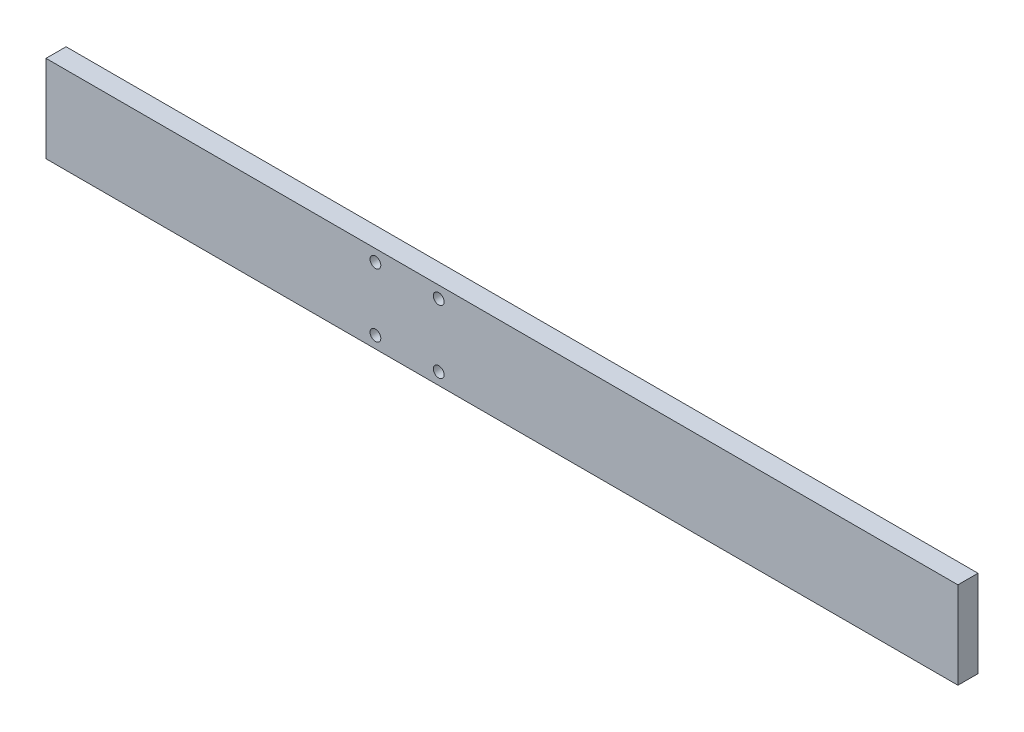
ISO-10303-21;
HEADER;
FILE_DESCRIPTION(('STEP AP214'),'2;1');
FILE_NAME('part.step','',(''),(''),'','','');
FILE_SCHEMA(('AUTOMOTIVE_DESIGN { 1 0 10303 214 1 1 1 1 }'));
ENDSEC;
DATA;
#1=APPLICATION_CONTEXT('core data for automotive mechanical design processes');
#2=APPLICATION_PROTOCOL_DEFINITION('international standard','automotive_design',2000,#1);
#3=PRODUCT_CONTEXT('',#1,'mechanical');
#4=PRODUCT('Part','Part','',(#3));
#5=PRODUCT_RELATED_PRODUCT_CATEGORY('part','',(#4));
#6=PRODUCT_DEFINITION_FORMATION('','',#4);
#7=PRODUCT_DEFINITION_CONTEXT('part definition',#1,'design');
#8=PRODUCT_DEFINITION('design','',#6,#7);
#9=PRODUCT_DEFINITION_SHAPE('','',#8);
#10=(LENGTH_UNIT() NAMED_UNIT(*) SI_UNIT(.MILLI.,.METRE.));
#11=(NAMED_UNIT(*) PLANE_ANGLE_UNIT() SI_UNIT($,.RADIAN.));
#12=(NAMED_UNIT(*) SI_UNIT($,.STERADIAN.) SOLID_ANGLE_UNIT());
#13=UNCERTAINTY_MEASURE_WITH_UNIT(LENGTH_MEASURE(1.E-05),#10,'distance_accuracy_value','');
#14=(GEOMETRIC_REPRESENTATION_CONTEXT(3) GLOBAL_UNCERTAINTY_ASSIGNED_CONTEXT((#13)) GLOBAL_UNIT_ASSIGNED_CONTEXT((#10,
#11,#12)) REPRESENTATION_CONTEXT('',''));
#15=CARTESIAN_POINT('',(0.,0.,0.));
#16=DIRECTION('',(0.,0.,1.));
#17=DIRECTION('',(1.,0.,0.));
#18=AXIS2_PLACEMENT_3D('',#15,#16,#17);
#19=CARTESIAN_POINT('',(0.,0.,6.35));
#20=DIRECTION('',(0.,0.,1.));
#21=DIRECTION('',(1.,0.,0.));
#22=AXIS2_PLACEMENT_3D('',#19,#20,#21);
#23=PLANE('',#22);
#24=CARTESIAN_POINT('',(124.145,23.75,6.35));
#25=DIRECTION('',(0.,0.,1.));
#26=DIRECTION('',(1.,0.,0.));
#27=AXIS2_PLACEMENT_3D('',#24,#25,#26);
#28=CIRCLE('',#27,1.70000000000003);
#29=CARTESIAN_POINT('',(125.845,23.75,6.35));
#30=VERTEX_POINT('',#29);
#31=EDGE_CURVE('E119',#30,#30,#28,.T.);
#32=ORIENTED_EDGE('',*,*,#31,.F.);
#33=EDGE_LOOP('',(#32));
#34=FACE_BOUND('',#33,.T.);
#35=CARTESIAN_POINT('',(104.145,3.75000000000001,6.35));
#36=DIRECTION('',(0.,0.,1.));
#37=DIRECTION('',(1.,0.,0.));
#38=AXIS2_PLACEMENT_3D('',#35,#36,#37);
#39=CIRCLE('',#38,1.70000000000001);
#40=CARTESIAN_POINT('',(105.845,3.75000000000001,6.35));
#41=VERTEX_POINT('',#40);
#42=EDGE_CURVE('E101',#41,#41,#39,.T.);
#43=ORIENTED_EDGE('',*,*,#42,.F.);
#44=EDGE_LOOP('',(#43));
#45=FACE_BOUND('',#44,.T.);
#46=DIRECTION('',(0.,1.,0.));
#47=VECTOR('',#46,1.);
#48=CARTESIAN_POINT('',(288.29,0.,6.35));
#49=LINE('',#48,#47);
#50=CARTESIAN_POINT('',(288.29,0.,6.35));
#51=VERTEX_POINT('',#50);
#52=CARTESIAN_POINT('',(288.29,27.5,6.35));
#53=VERTEX_POINT('',#52);
#54=EDGE_CURVE('E84',#51,#53,#49,.T.);
#55=ORIENTED_EDGE('',*,*,#54,.T.);
#56=DIRECTION('',(-1.,0.,0.));
#57=VECTOR('',#56,1.);
#58=CARTESIAN_POINT('',(288.29,27.5,6.35));
#59=LINE('',#58,#57);
#60=CARTESIAN_POINT('',(0.,27.5,6.35));
#61=VERTEX_POINT('',#60);
#62=EDGE_CURVE('E78',#53,#61,#59,.T.);
#63=ORIENTED_EDGE('',*,*,#62,.T.);
#64=DIRECTION('',(0.,-1.,0.));
#65=VECTOR('',#64,1.);
#66=CARTESIAN_POINT('',(0.,27.5,6.35));
#67=LINE('',#66,#65);
#68=CARTESIAN_POINT('',(0.,0.,6.35));
#69=VERTEX_POINT('',#68);
#70=EDGE_CURVE('E81',#61,#69,#67,.T.);
#71=ORIENTED_EDGE('',*,*,#70,.T.);
#72=DIRECTION('',(1.,0.,0.));
#73=VECTOR('',#72,1.);
#74=CARTESIAN_POINT('',(0.,0.,6.35));
#75=LINE('',#74,#73);
#76=EDGE_CURVE('E50',#69,#51,#75,.T.);
#77=ORIENTED_EDGE('',*,*,#76,.T.);
#78=EDGE_LOOP('',(#55,#63,#71,#77));
#79=FACE_BOUND('',#78,.T.);
#80=CARTESIAN_POINT('',(124.145,3.75000000000001,6.35));
#81=DIRECTION('',(0.,0.,1.));
#82=DIRECTION('',(1.,0.,0.));
#83=AXIS2_PLACEMENT_3D('',#80,#81,#82);
#84=CIRCLE('',#83,1.70000000000003);
#85=CARTESIAN_POINT('',(125.845,3.75000000000001,6.35));
#86=VERTEX_POINT('',#85);
#87=EDGE_CURVE('E113',#86,#86,#84,.T.);
#88=ORIENTED_EDGE('',*,*,#87,.F.);
#89=EDGE_LOOP('',(#88));
#90=FACE_BOUND('',#89,.T.);
#91=CARTESIAN_POINT('',(104.145,23.75,6.35));
#92=DIRECTION('',(0.,0.,1.));
#93=DIRECTION('',(1.,0.,0.));
#94=AXIS2_PLACEMENT_3D('',#91,#92,#93);
#95=CIRCLE('',#94,1.70000000000001);
#96=CARTESIAN_POINT('',(105.845,23.75,6.35));
#97=VERTEX_POINT('',#96);
#98=EDGE_CURVE('E125',#97,#97,#95,.T.);
#99=ORIENTED_EDGE('',*,*,#98,.F.);
#100=EDGE_LOOP('',(#99));
#101=FACE_BOUND('',#100,.T.);
#102=ADVANCED_FACE('F33',(#34,#45,#79,#90,#101),#23,.T.);
#103=CARTESIAN_POINT('',(0.,0.,0.));
#104=DIRECTION('',(0.,0.,1.));
#105=DIRECTION('',(1.,0.,0.));
#106=AXIS2_PLACEMENT_3D('',#103,#104,#105);
#107=PLANE('',#106);
#108=DIRECTION('',(0.,1.,0.));
#109=VECTOR('',#108,1.);
#110=CARTESIAN_POINT('',(288.29,0.,0.));
#111=LINE('',#110,#109);
#112=CARTESIAN_POINT('',(288.29,0.,0.));
#113=VERTEX_POINT('',#112);
#114=CARTESIAN_POINT('',(288.29,27.5,0.));
#115=VERTEX_POINT('',#114);
#116=EDGE_CURVE('E98',#113,#115,#111,.T.);
#117=ORIENTED_EDGE('',*,*,#116,.F.);
#118=DIRECTION('',(1.,0.,0.));
#119=VECTOR('',#118,1.);
#120=CARTESIAN_POINT('',(242.29,0.,0.));
#121=LINE('',#120,#119);
#122=CARTESIAN_POINT('',(0.,0.,0.));
#123=VERTEX_POINT('',#122);
#124=EDGE_CURVE('E67',#123,#113,#121,.T.);
#125=ORIENTED_EDGE('',*,*,#124,.F.);
#126=DIRECTION('',(0.,-1.,0.));
#127=VECTOR('',#126,1.);
#128=CARTESIAN_POINT('',(0.,27.5,0.));
#129=LINE('',#128,#127);
#130=CARTESIAN_POINT('',(0.,27.5,0.));
#131=VERTEX_POINT('',#130);
#132=EDGE_CURVE('E103',#131,#123,#129,.T.);
#133=ORIENTED_EDGE('',*,*,#132,.F.);
#134=DIRECTION('',(-1.,0.,0.));
#135=VECTOR('',#134,1.);
#136=CARTESIAN_POINT('',(288.29,27.5,0.));
#137=LINE('',#136,#135);
#138=EDGE_CURVE('E89',#115,#131,#137,.T.);
#139=ORIENTED_EDGE('',*,*,#138,.F.);
#140=EDGE_LOOP('',(#117,#125,#133,#139));
#141=FACE_BOUND('',#140,.T.);
#142=CARTESIAN_POINT('',(104.145,3.75000000000001,0.));
#143=DIRECTION('',(0.,0.,1.));
#144=DIRECTION('',(1.,0.,0.));
#145=AXIS2_PLACEMENT_3D('',#142,#143,#144);
#146=CIRCLE('',#145,1.70000000000001);
#147=CARTESIAN_POINT('',(105.845,3.75000000000001,0.));
#148=VERTEX_POINT('',#147);
#149=EDGE_CURVE('E110',#148,#148,#146,.T.);
#150=ORIENTED_EDGE('',*,*,#149,.T.);
#151=EDGE_LOOP('',(#150));
#152=FACE_BOUND('',#151,.T.);
#153=CARTESIAN_POINT('',(124.145,3.75000000000001,0.));
#154=DIRECTION('',(0.,0.,1.));
#155=DIRECTION('',(1.,0.,0.));
#156=AXIS2_PLACEMENT_3D('',#153,#154,#155);
#157=CIRCLE('',#156,1.70000000000003);
#158=CARTESIAN_POINT('',(125.845,3.75000000000001,0.));
#159=VERTEX_POINT('',#158);
#160=EDGE_CURVE('E116',#159,#159,#157,.T.);
#161=ORIENTED_EDGE('',*,*,#160,.T.);
#162=EDGE_LOOP('',(#161));
#163=FACE_BOUND('',#162,.T.);
#164=CARTESIAN_POINT('',(124.145,23.75,0.));
#165=DIRECTION('',(0.,0.,1.));
#166=DIRECTION('',(1.,0.,0.));
#167=AXIS2_PLACEMENT_3D('',#164,#165,#166);
#168=CIRCLE('',#167,1.70000000000003);
#169=CARTESIAN_POINT('',(125.845,23.75,0.));
#170=VERTEX_POINT('',#169);
#171=EDGE_CURVE('E122',#170,#170,#168,.T.);
#172=ORIENTED_EDGE('',*,*,#171,.T.);
#173=EDGE_LOOP('',(#172));
#174=FACE_BOUND('',#173,.T.);
#175=CARTESIAN_POINT('',(104.145,23.75,0.));
#176=DIRECTION('',(0.,0.,1.));
#177=DIRECTION('',(1.,0.,0.));
#178=AXIS2_PLACEMENT_3D('',#175,#176,#177);
#179=CIRCLE('',#178,1.70000000000001);
#180=CARTESIAN_POINT('',(105.845,23.75,0.));
#181=VERTEX_POINT('',#180);
#182=EDGE_CURVE('E128',#181,#181,#179,.T.);
#183=ORIENTED_EDGE('',*,*,#182,.T.);
#184=EDGE_LOOP('',(#183));
#185=FACE_BOUND('',#184,.T.);
#186=ADVANCED_FACE('F138',(#141,#152,#163,#174,#185),#107,.F.);
#187=CARTESIAN_POINT('',(288.29,0.,6.35));
#188=DIRECTION('',(-1.,0.,0.));
#189=DIRECTION('',(0.,0.,1.));
#190=AXIS2_PLACEMENT_3D('',#187,#188,#189);
#191=PLANE('',#190);
#192=ORIENTED_EDGE('',*,*,#116,.T.);
#193=DIRECTION('',(0.,0.,-1.));
#194=VECTOR('',#193,1.);
#195=CARTESIAN_POINT('',(288.29,27.5,6.35));
#196=LINE('',#195,#194);
#197=EDGE_CURVE('E11',#53,#115,#196,.T.);
#198=ORIENTED_EDGE('',*,*,#197,.F.);
#199=ORIENTED_EDGE('',*,*,#54,.F.);
#200=DIRECTION('',(0.,0.,-1.));
#201=VECTOR('',#200,1.);
#202=CARTESIAN_POINT('',(288.29,0.,6.35));
#203=LINE('',#202,#201);
#204=EDGE_CURVE('E94',#51,#113,#203,.T.);
#205=ORIENTED_EDGE('',*,*,#204,.T.);
#206=EDGE_LOOP('',(#192,#198,#199,#205));
#207=FACE_BOUND('',#206,.T.);
#208=ADVANCED_FACE('F35',(#207),#191,.F.);
#209=CARTESIAN_POINT('',(288.29,27.5,6.35));
#210=DIRECTION('',(0.,-1.,0.));
#211=DIRECTION('',(0.,0.,-1.));
#212=AXIS2_PLACEMENT_3D('',#209,#210,#211);
#213=PLANE('',#212);
#214=ORIENTED_EDGE('',*,*,#138,.T.);
#215=DIRECTION('',(0.,0.,-1.));
#216=VECTOR('',#215,1.);
#217=CARTESIAN_POINT('',(0.,27.5,6.35));
#218=LINE('',#217,#216);
#219=EDGE_CURVE('E42',#61,#131,#218,.T.);
#220=ORIENTED_EDGE('',*,*,#219,.F.);
#221=ORIENTED_EDGE('',*,*,#62,.F.);
#222=ORIENTED_EDGE('',*,*,#197,.T.);
#223=EDGE_LOOP('',(#214,#220,#221,#222));
#224=FACE_BOUND('',#223,.T.);
#225=ADVANCED_FACE('F88',(#224),#213,.F.);
#226=CARTESIAN_POINT('',(0.,27.5,6.35));
#227=DIRECTION('',(1.,0.,0.));
#228=DIRECTION('',(0.,0.,-1.));
#229=AXIS2_PLACEMENT_3D('',#226,#227,#228);
#230=PLANE('',#229);
#231=ORIENTED_EDGE('',*,*,#132,.T.);
#232=DIRECTION('',(0.,0.,-1.));
#233=VECTOR('',#232,1.);
#234=CARTESIAN_POINT('',(0.,0.,6.35));
#235=LINE('',#234,#233);
#236=EDGE_CURVE('E91',#69,#123,#235,.T.);
#237=ORIENTED_EDGE('',*,*,#236,.F.);
#238=ORIENTED_EDGE('',*,*,#70,.F.);
#239=ORIENTED_EDGE('',*,*,#219,.T.);
#240=EDGE_LOOP('',(#231,#237,#238,#239));
#241=FACE_BOUND('',#240,.T.);
#242=ADVANCED_FACE('F92',(#241),#230,.F.);
#243=CARTESIAN_POINT('',(242.29,0.,6.35));
#244=DIRECTION('',(0.,1.,0.));
#245=DIRECTION('',(0.,0.,1.));
#246=AXIS2_PLACEMENT_3D('',#243,#244,#245);
#247=PLANE('',#246);
#248=ORIENTED_EDGE('',*,*,#124,.T.);
#249=ORIENTED_EDGE('',*,*,#204,.F.);
#250=ORIENTED_EDGE('',*,*,#76,.F.);
#251=ORIENTED_EDGE('',*,*,#236,.T.);
#252=EDGE_LOOP('',(#248,#249,#250,#251));
#253=FACE_BOUND('',#252,.T.);
#254=ADVANCED_FACE('F107',(#253),#247,.F.);
#255=CARTESIAN_POINT('',(104.145,3.75000000000001,6.35));
#256=DIRECTION('',(0.,0.,-1.));
#257=DIRECTION('',(-1.,0.,0.));
#258=AXIS2_PLACEMENT_3D('',#255,#256,#257);
#259=CYLINDRICAL_SURFACE('',#258,1.70000000000001);
#260=ORIENTED_EDGE('',*,*,#42,.T.);
#261=EDGE_LOOP('',(#260));
#262=FACE_BOUND('',#261,.T.);
#263=ORIENTED_EDGE('',*,*,#149,.F.);
#264=EDGE_LOOP('',(#263));
#265=FACE_BOUND('',#264,.T.);
#266=ADVANCED_FACE('F148',(#262,#265),#259,.F.);
#267=CARTESIAN_POINT('',(124.145,3.75000000000001,6.35));
#268=DIRECTION('',(0.,0.,-1.));
#269=DIRECTION('',(-1.,0.,0.));
#270=AXIS2_PLACEMENT_3D('',#267,#268,#269);
#271=CYLINDRICAL_SURFACE('',#270,1.70000000000003);
#272=ORIENTED_EDGE('',*,*,#87,.T.);
#273=EDGE_LOOP('',(#272));
#274=FACE_BOUND('',#273,.T.);
#275=ORIENTED_EDGE('',*,*,#160,.F.);
#276=EDGE_LOOP('',(#275));
#277=FACE_BOUND('',#276,.T.);
#278=ADVANCED_FACE('F197',(#274,#277),#271,.F.);
#279=CARTESIAN_POINT('',(124.145,23.75,6.35));
#280=DIRECTION('',(0.,0.,-1.));
#281=DIRECTION('',(-1.,0.,0.));
#282=AXIS2_PLACEMENT_3D('',#279,#280,#281);
#283=CYLINDRICAL_SURFACE('',#282,1.70000000000003);
#284=ORIENTED_EDGE('',*,*,#31,.T.);
#285=EDGE_LOOP('',(#284));
#286=FACE_BOUND('',#285,.T.);
#287=ORIENTED_EDGE('',*,*,#171,.F.);
#288=EDGE_LOOP('',(#287));
#289=FACE_BOUND('',#288,.T.);
#290=ADVANCED_FACE('F205',(#286,#289),#283,.F.);
#291=CARTESIAN_POINT('',(104.145,23.75,6.35));
#292=DIRECTION('',(0.,0.,-1.));
#293=DIRECTION('',(-1.,0.,0.));
#294=AXIS2_PLACEMENT_3D('',#291,#292,#293);
#295=CYLINDRICAL_SURFACE('',#294,1.70000000000001);
#296=ORIENTED_EDGE('',*,*,#98,.T.);
#297=EDGE_LOOP('',(#296));
#298=FACE_BOUND('',#297,.T.);
#299=ORIENTED_EDGE('',*,*,#182,.F.);
#300=EDGE_LOOP('',(#299));
#301=FACE_BOUND('',#300,.T.);
#302=ADVANCED_FACE('F134',(#298,#301),#295,.F.);
#303=CLOSED_SHELL('',(#102,#186,#208,#225,#242,#254,#266,#278,#290,#302));
#304=MANIFOLD_SOLID_BREP('B2',#303);
#305=ADVANCED_BREP_SHAPE_REPRESENTATION('',(#18,#304),#14);
#306=SHAPE_DEFINITION_REPRESENTATION(#9,#305);
ENDSEC;
END-ISO-10303-21;
